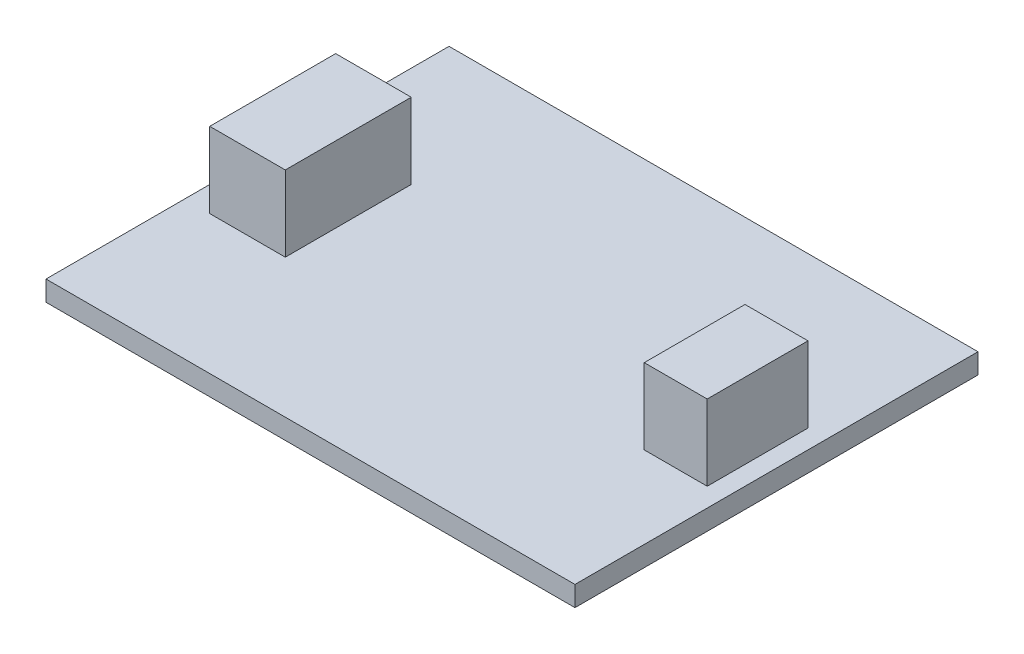
ISO-10303-21;
HEADER;
FILE_DESCRIPTION(('STEP AP214'),'2;1');
FILE_NAME('part.step','',(''),(''),'','','');
FILE_SCHEMA(('AUTOMOTIVE_DESIGN { 1 0 10303 214 1 1 1 1 }'));
ENDSEC;
DATA;
#1=APPLICATION_CONTEXT('core data for automotive mechanical design processes');
#2=APPLICATION_PROTOCOL_DEFINITION('international standard','automotive_design',2000,#1);
#3=PRODUCT_CONTEXT('',#1,'mechanical');
#4=PRODUCT('Part','Part','',(#3));
#5=PRODUCT_RELATED_PRODUCT_CATEGORY('part','',(#4));
#6=PRODUCT_DEFINITION_FORMATION('','',#4);
#7=PRODUCT_DEFINITION_CONTEXT('part definition',#1,'design');
#8=PRODUCT_DEFINITION('design','',#6,#7);
#9=PRODUCT_DEFINITION_SHAPE('','',#8);
#10=(LENGTH_UNIT() NAMED_UNIT(*) SI_UNIT(.MILLI.,.METRE.));
#11=(NAMED_UNIT(*) PLANE_ANGLE_UNIT() SI_UNIT($,.RADIAN.));
#12=(NAMED_UNIT(*) SI_UNIT($,.STERADIAN.) SOLID_ANGLE_UNIT());
#13=UNCERTAINTY_MEASURE_WITH_UNIT(LENGTH_MEASURE(1.E-05),#10,'distance_accuracy_value','');
#14=(GEOMETRIC_REPRESENTATION_CONTEXT(3) GLOBAL_UNCERTAINTY_ASSIGNED_CONTEXT((#13)) GLOBAL_UNIT_ASSIGNED_CONTEXT((#10,
#11,#12)) REPRESENTATION_CONTEXT('',''));
#15=CARTESIAN_POINT('',(0.,0.,0.));
#16=DIRECTION('',(0.,0.,1.));
#17=DIRECTION('',(1.,0.,0.));
#18=AXIS2_PLACEMENT_3D('',#15,#16,#17);
#19=CARTESIAN_POINT('',(0.,1.6,0.));
#20=DIRECTION('',(0.,-1.,0.));
#21=DIRECTION('',(0.,0.,-1.));
#22=AXIS2_PLACEMENT_3D('',#19,#20,#21);
#23=PLANE('',#22);
#24=DIRECTION('',(0.,0.,1.));
#25=VECTOR('',#24,1.);
#26=CARTESIAN_POINT('',(-19.,1.6,-5.));
#27=LINE('',#26,#25);
#28=CARTESIAN_POINT('',(-19.,1.6,-5.));
#29=VERTEX_POINT('',#28);
#30=CARTESIAN_POINT('',(-19.,1.6,5.));
#31=VERTEX_POINT('',#30);
#32=EDGE_CURVE('E160',#29,#31,#27,.T.);
#33=ORIENTED_EDGE('',*,*,#32,.F.);
#34=DIRECTION('',(-1.,0.,0.));
#35=VECTOR('',#34,1.);
#36=CARTESIAN_POINT('',(-13.,1.6,-5.));
#37=LINE('',#36,#35);
#38=CARTESIAN_POINT('',(-13.,1.6,-5.));
#39=VERTEX_POINT('',#38);
#40=EDGE_CURVE('E168',#39,#29,#37,.T.);
#41=ORIENTED_EDGE('',*,*,#40,.F.);
#42=DIRECTION('',(0.,0.,-1.));
#43=VECTOR('',#42,1.);
#44=CARTESIAN_POINT('',(-13.,1.6,5.));
#45=LINE('',#44,#43);
#46=CARTESIAN_POINT('',(-13.,1.6,5.));
#47=VERTEX_POINT('',#46);
#48=EDGE_CURVE('E176',#47,#39,#45,.T.);
#49=ORIENTED_EDGE('',*,*,#48,.F.);
#50=DIRECTION('',(1.,0.,0.));
#51=VECTOR('',#50,1.);
#52=CARTESIAN_POINT('',(-19.,1.6,5.));
#53=LINE('',#52,#51);
#54=EDGE_CURVE('E159',#31,#47,#53,.T.);
#55=ORIENTED_EDGE('',*,*,#54,.F.);
#56=EDGE_LOOP('',(#33,#41,#49,#55));
#57=FACE_BOUND('',#56,.T.);
#58=DIRECTION('',(0.,0.,-1.));
#59=VECTOR('',#58,1.);
#60=CARTESIAN_POINT('',(21.,1.6,16.));
#61=LINE('',#60,#59);
#62=CARTESIAN_POINT('',(21.,1.6,16.));
#63=VERTEX_POINT('',#62);
#64=CARTESIAN_POINT('',(21.,1.6,-16.));
#65=VERTEX_POINT('',#64);
#66=EDGE_CURVE('E198',#63,#65,#61,.T.);
#67=ORIENTED_EDGE('',*,*,#66,.T.);
#68=DIRECTION('',(-1.,0.,0.));
#69=VECTOR('',#68,1.);
#70=CARTESIAN_POINT('',(-21.,1.6,-16.));
#71=LINE('',#70,#69);
#72=CARTESIAN_POINT('',(-21.,1.6,-16.));
#73=VERTEX_POINT('',#72);
#74=EDGE_CURVE('E200',#65,#73,#71,.T.);
#75=ORIENTED_EDGE('',*,*,#74,.T.);
#76=DIRECTION('',(0.,0.,1.));
#77=VECTOR('',#76,1.);
#78=CARTESIAN_POINT('',(-21.,1.6,16.));
#79=LINE('',#78,#77);
#80=CARTESIAN_POINT('',(-21.,1.6,16.));
#81=VERTEX_POINT('',#80);
#82=EDGE_CURVE('E205',#73,#81,#79,.T.);
#83=ORIENTED_EDGE('',*,*,#82,.T.);
#84=DIRECTION('',(1.,0.,0.));
#85=VECTOR('',#84,1.);
#86=CARTESIAN_POINT('',(-21.,1.6,16.));
#87=LINE('',#86,#85);
#88=EDGE_CURVE('E204',#81,#63,#87,.T.);
#89=ORIENTED_EDGE('',*,*,#88,.T.);
#90=EDGE_LOOP('',(#67,#75,#83,#89));
#91=FACE_BOUND('',#90,.T.);
#92=DIRECTION('',(0.,0.,1.));
#93=VECTOR('',#92,1.);
#94=CARTESIAN_POINT('',(14.5,1.6,-4.));
#95=LINE('',#94,#93);
#96=CARTESIAN_POINT('',(14.5,1.6,-4.));
#97=VERTEX_POINT('',#96);
#98=CARTESIAN_POINT('',(14.5,1.6,4.));
#99=VERTEX_POINT('',#98);
#100=EDGE_CURVE('E156',#97,#99,#95,.T.);
#101=ORIENTED_EDGE('',*,*,#100,.F.);
#102=DIRECTION('',(-1.,0.,0.));
#103=VECTOR('',#102,1.);
#104=CARTESIAN_POINT('',(19.5,1.6,-4.));
#105=LINE('',#104,#103);
#106=CARTESIAN_POINT('',(19.5,1.6,-4.));
#107=VERTEX_POINT('',#106);
#108=EDGE_CURVE('E153',#107,#97,#105,.T.);
#109=ORIENTED_EDGE('',*,*,#108,.F.);
#110=DIRECTION('',(0.,0.,-1.));
#111=VECTOR('',#110,1.);
#112=CARTESIAN_POINT('',(19.5,1.6,4.));
#113=LINE('',#112,#111);
#114=CARTESIAN_POINT('',(19.5,1.6,4.));
#115=VERTEX_POINT('',#114);
#116=EDGE_CURVE('E69',#115,#107,#113,.T.);
#117=ORIENTED_EDGE('',*,*,#116,.F.);
#118=DIRECTION('',(1.,0.,0.));
#119=VECTOR('',#118,1.);
#120=CARTESIAN_POINT('',(14.5,1.6,4.));
#121=LINE('',#120,#119);
#122=EDGE_CURVE('E65',#99,#115,#121,.T.);
#123=ORIENTED_EDGE('',*,*,#122,.F.);
#124=EDGE_LOOP('',(#101,#109,#117,#123));
#125=FACE_BOUND('',#124,.T.);
#126=ADVANCED_FACE('F50',(#57,#91,#125),#23,.F.);
#127=CARTESIAN_POINT('',(21.,1.6,16.));
#128=DIRECTION('',(-1.,0.,0.));
#129=DIRECTION('',(0.,0.,1.));
#130=AXIS2_PLACEMENT_3D('',#127,#128,#129);
#131=PLANE('',#130);
#132=DIRECTION('',(0.,0.,-1.));
#133=VECTOR('',#132,1.);
#134=CARTESIAN_POINT('',(21.,0.,16.));
#135=LINE('',#134,#133);
#136=CARTESIAN_POINT('',(21.,0.,16.));
#137=VERTEX_POINT('',#136);
#138=CARTESIAN_POINT('',(21.,0.,-16.));
#139=VERTEX_POINT('',#138);
#140=EDGE_CURVE('E193',#137,#139,#135,.T.);
#141=ORIENTED_EDGE('',*,*,#140,.T.);
#142=DIRECTION('',(0.,-1.,0.));
#143=VECTOR('',#142,1.);
#144=CARTESIAN_POINT('',(21.,1.6,-16.));
#145=LINE('',#144,#143);
#146=EDGE_CURVE('E11',#65,#139,#145,.T.);
#147=ORIENTED_EDGE('',*,*,#146,.F.);
#148=ORIENTED_EDGE('',*,*,#66,.F.);
#149=DIRECTION('',(0.,-1.,0.));
#150=VECTOR('',#149,1.);
#151=CARTESIAN_POINT('',(21.,1.6,16.));
#152=LINE('',#151,#150);
#153=EDGE_CURVE('E206',#63,#137,#152,.T.);
#154=ORIENTED_EDGE('',*,*,#153,.T.);
#155=EDGE_LOOP('',(#141,#147,#148,#154));
#156=FACE_BOUND('',#155,.T.);
#157=ADVANCED_FACE('F47',(#156),#131,.F.);
#158=CARTESIAN_POINT('',(-21.,1.6,-16.));
#159=DIRECTION('',(0.,0.,1.));
#160=DIRECTION('',(1.,0.,0.));
#161=AXIS2_PLACEMENT_3D('',#158,#159,#160);
#162=PLANE('',#161);
#163=DIRECTION('',(-1.,0.,0.));
#164=VECTOR('',#163,1.);
#165=CARTESIAN_POINT('',(-21.,0.,-16.));
#166=LINE('',#165,#164);
#167=CARTESIAN_POINT('',(-21.,0.,-16.));
#168=VERTEX_POINT('',#167);
#169=EDGE_CURVE('E207',#139,#168,#166,.T.);
#170=ORIENTED_EDGE('',*,*,#169,.T.);
#171=DIRECTION('',(0.,-1.,0.));
#172=VECTOR('',#171,1.);
#173=CARTESIAN_POINT('',(-21.,1.6,-16.));
#174=LINE('',#173,#172);
#175=EDGE_CURVE('E54',#73,#168,#174,.T.);
#176=ORIENTED_EDGE('',*,*,#175,.F.);
#177=ORIENTED_EDGE('',*,*,#74,.F.);
#178=ORIENTED_EDGE('',*,*,#146,.T.);
#179=EDGE_LOOP('',(#170,#176,#177,#178));
#180=FACE_BOUND('',#179,.T.);
#181=ADVANCED_FACE('F236',(#180),#162,.F.);
#182=CARTESIAN_POINT('',(-21.,1.6,16.));
#183=DIRECTION('',(1.,0.,0.));
#184=DIRECTION('',(0.,0.,-1.));
#185=AXIS2_PLACEMENT_3D('',#182,#183,#184);
#186=PLANE('',#185);
#187=DIRECTION('',(0.,0.,1.));
#188=VECTOR('',#187,1.);
#189=CARTESIAN_POINT('',(-21.,0.,16.));
#190=LINE('',#189,#188);
#191=CARTESIAN_POINT('',(-21.,0.,16.));
#192=VERTEX_POINT('',#191);
#193=EDGE_CURVE('E211',#168,#192,#190,.T.);
#194=ORIENTED_EDGE('',*,*,#193,.T.);
#195=DIRECTION('',(0.,-1.,0.));
#196=VECTOR('',#195,1.);
#197=CARTESIAN_POINT('',(-21.,1.6,16.));
#198=LINE('',#197,#196);
#199=EDGE_CURVE('E216',#81,#192,#198,.T.);
#200=ORIENTED_EDGE('',*,*,#199,.F.);
#201=ORIENTED_EDGE('',*,*,#82,.F.);
#202=ORIENTED_EDGE('',*,*,#175,.T.);
#203=EDGE_LOOP('',(#194,#200,#201,#202));
#204=FACE_BOUND('',#203,.T.);
#205=ADVANCED_FACE('F224',(#204),#186,.F.);
#206=CARTESIAN_POINT('',(-21.,1.6,16.));
#207=DIRECTION('',(0.,0.,-1.));
#208=DIRECTION('',(-1.,0.,0.));
#209=AXIS2_PLACEMENT_3D('',#206,#207,#208);
#210=PLANE('',#209);
#211=DIRECTION('',(1.,0.,0.));
#212=VECTOR('',#211,1.);
#213=CARTESIAN_POINT('',(-21.,0.,16.));
#214=LINE('',#213,#212);
#215=EDGE_CURVE('E199',#192,#137,#214,.T.);
#216=ORIENTED_EDGE('',*,*,#215,.T.);
#217=ORIENTED_EDGE('',*,*,#153,.F.);
#218=ORIENTED_EDGE('',*,*,#88,.F.);
#219=ORIENTED_EDGE('',*,*,#199,.T.);
#220=EDGE_LOOP('',(#216,#217,#218,#219));
#221=FACE_BOUND('',#220,.T.);
#222=ADVANCED_FACE('F234',(#221),#210,.F.);
#223=CARTESIAN_POINT('',(0.,0.,0.));
#224=DIRECTION('',(0.,-1.,0.));
#225=DIRECTION('',(0.,0.,-1.));
#226=AXIS2_PLACEMENT_3D('',#223,#224,#225);
#227=PLANE('',#226);
#228=ORIENTED_EDGE('',*,*,#140,.F.);
#229=ORIENTED_EDGE('',*,*,#215,.F.);
#230=ORIENTED_EDGE('',*,*,#193,.F.);
#231=ORIENTED_EDGE('',*,*,#169,.F.);
#232=EDGE_LOOP('',(#228,#229,#230,#231));
#233=FACE_BOUND('',#232,.T.);
#234=ADVANCED_FACE('F229',(#233),#227,.T.);
#235=CARTESIAN_POINT('',(-19.,7.6,-5.));
#236=DIRECTION('',(1.,0.,0.));
#237=DIRECTION('',(0.,0.,-1.));
#238=AXIS2_PLACEMENT_3D('',#235,#236,#237);
#239=PLANE('',#238);
#240=ORIENTED_EDGE('',*,*,#32,.T.);
#241=DIRECTION('',(0.,-1.,0.));
#242=VECTOR('',#241,1.);
#243=CARTESIAN_POINT('',(-19.,7.6,5.));
#244=LINE('',#243,#242);
#245=CARTESIAN_POINT('',(-19.,7.6,5.));
#246=VERTEX_POINT('',#245);
#247=EDGE_CURVE('E194',#246,#31,#244,.T.);
#248=ORIENTED_EDGE('',*,*,#247,.F.);
#249=DIRECTION('',(0.,0.,1.));
#250=VECTOR('',#249,1.);
#251=CARTESIAN_POINT('',(-19.,7.6,-5.));
#252=LINE('',#251,#250);
#253=CARTESIAN_POINT('',(-19.,7.6,-5.));
#254=VERTEX_POINT('',#253);
#255=EDGE_CURVE('E167',#254,#246,#252,.T.);
#256=ORIENTED_EDGE('',*,*,#255,.F.);
#257=DIRECTION('',(0.,-1.,0.));
#258=VECTOR('',#257,1.);
#259=CARTESIAN_POINT('',(-19.,7.6,-5.));
#260=LINE('',#259,#258);
#261=EDGE_CURVE('E172',#254,#29,#260,.T.);
#262=ORIENTED_EDGE('',*,*,#261,.T.);
#263=EDGE_LOOP('',(#240,#248,#256,#262));
#264=FACE_BOUND('',#263,.T.);
#265=ADVANCED_FACE('F255',(#264),#239,.F.);
#266=CARTESIAN_POINT('',(-19.,7.6,5.));
#267=DIRECTION('',(0.,0.,-1.));
#268=DIRECTION('',(-1.,0.,0.));
#269=AXIS2_PLACEMENT_3D('',#266,#267,#268);
#270=PLANE('',#269);
#271=ORIENTED_EDGE('',*,*,#54,.T.);
#272=DIRECTION('',(0.,-1.,0.));
#273=VECTOR('',#272,1.);
#274=CARTESIAN_POINT('',(-13.,7.6,5.));
#275=LINE('',#274,#273);
#276=CARTESIAN_POINT('',(-13.,7.6,5.));
#277=VERTEX_POINT('',#276);
#278=EDGE_CURVE('E189',#277,#47,#275,.T.);
#279=ORIENTED_EDGE('',*,*,#278,.F.);
#280=DIRECTION('',(1.,0.,0.));
#281=VECTOR('',#280,1.);
#282=CARTESIAN_POINT('',(-19.,7.6,5.));
#283=LINE('',#282,#281);
#284=EDGE_CURVE('E166',#246,#277,#283,.T.);
#285=ORIENTED_EDGE('',*,*,#284,.F.);
#286=ORIENTED_EDGE('',*,*,#247,.T.);
#287=EDGE_LOOP('',(#271,#279,#285,#286));
#288=FACE_BOUND('',#287,.T.);
#289=ADVANCED_FACE('F280',(#288),#270,.F.);
#290=CARTESIAN_POINT('',(-13.,7.6,5.));
#291=DIRECTION('',(-1.,0.,0.));
#292=DIRECTION('',(0.,0.,1.));
#293=AXIS2_PLACEMENT_3D('',#290,#291,#292);
#294=PLANE('',#293);
#295=ORIENTED_EDGE('',*,*,#48,.T.);
#296=DIRECTION('',(0.,-1.,0.));
#297=VECTOR('',#296,1.);
#298=CARTESIAN_POINT('',(-13.,7.6,-5.));
#299=LINE('',#298,#297);
#300=CARTESIAN_POINT('',(-13.,7.6,-5.));
#301=VERTEX_POINT('',#300);
#302=EDGE_CURVE('E188',#301,#39,#299,.T.);
#303=ORIENTED_EDGE('',*,*,#302,.F.);
#304=DIRECTION('',(0.,0.,-1.));
#305=VECTOR('',#304,1.);
#306=CARTESIAN_POINT('',(-13.,7.6,5.));
#307=LINE('',#306,#305);
#308=EDGE_CURVE('E175',#277,#301,#307,.T.);
#309=ORIENTED_EDGE('',*,*,#308,.F.);
#310=ORIENTED_EDGE('',*,*,#278,.T.);
#311=EDGE_LOOP('',(#295,#303,#309,#310));
#312=FACE_BOUND('',#311,.T.);
#313=ADVANCED_FACE('F290',(#312),#294,.F.);
#314=CARTESIAN_POINT('',(-13.,7.6,-5.));
#315=DIRECTION('',(0.,0.,1.));
#316=DIRECTION('',(1.,0.,0.));
#317=AXIS2_PLACEMENT_3D('',#314,#315,#316);
#318=PLANE('',#317);
#319=ORIENTED_EDGE('',*,*,#40,.T.);
#320=ORIENTED_EDGE('',*,*,#261,.F.);
#321=DIRECTION('',(-1.,0.,0.));
#322=VECTOR('',#321,1.);
#323=CARTESIAN_POINT('',(-13.,7.6,-5.));
#324=LINE('',#323,#322);
#325=EDGE_CURVE('E174',#301,#254,#324,.T.);
#326=ORIENTED_EDGE('',*,*,#325,.F.);
#327=ORIENTED_EDGE('',*,*,#302,.T.);
#328=EDGE_LOOP('',(#319,#320,#326,#327));
#329=FACE_BOUND('',#328,.T.);
#330=ADVANCED_FACE('F299',(#329),#318,.F.);
#331=CARTESIAN_POINT('',(0.,7.6,0.));
#332=DIRECTION('',(0.,1.,0.));
#333=DIRECTION('',(0.,0.,1.));
#334=AXIS2_PLACEMENT_3D('',#331,#332,#333);
#335=PLANE('',#334);
#336=ORIENTED_EDGE('',*,*,#255,.T.);
#337=ORIENTED_EDGE('',*,*,#284,.T.);
#338=ORIENTED_EDGE('',*,*,#308,.T.);
#339=ORIENTED_EDGE('',*,*,#325,.T.);
#340=EDGE_LOOP('',(#336,#337,#338,#339));
#341=FACE_BOUND('',#340,.T.);
#342=ADVANCED_FACE('F309',(#341),#335,.T.);
#343=CARTESIAN_POINT('',(14.5,7.6,-4.));
#344=DIRECTION('',(1.,0.,0.));
#345=DIRECTION('',(0.,0.,-1.));
#346=AXIS2_PLACEMENT_3D('',#343,#344,#345);
#347=PLANE('',#346);
#348=ORIENTED_EDGE('',*,*,#100,.T.);
#349=DIRECTION('',(0.,-1.,0.));
#350=VECTOR('',#349,1.);
#351=CARTESIAN_POINT('',(14.5,7.6,4.));
#352=LINE('',#351,#350);
#353=CARTESIAN_POINT('',(14.5,7.6,4.));
#354=VERTEX_POINT('',#353);
#355=EDGE_CURVE('E139',#354,#99,#352,.T.);
#356=ORIENTED_EDGE('',*,*,#355,.F.);
#357=DIRECTION('',(0.,0.,1.));
#358=VECTOR('',#357,1.);
#359=CARTESIAN_POINT('',(14.5,7.6,-4.));
#360=LINE('',#359,#358);
#361=CARTESIAN_POINT('',(14.5,7.6,-4.));
#362=VERTEX_POINT('',#361);
#363=EDGE_CURVE('E145',#362,#354,#360,.T.);
#364=ORIENTED_EDGE('',*,*,#363,.F.);
#365=DIRECTION('',(0.,-1.,0.));
#366=VECTOR('',#365,1.);
#367=CARTESIAN_POINT('',(14.5,7.6,-4.));
#368=LINE('',#367,#366);
#369=EDGE_CURVE('E416',#362,#97,#368,.T.);
#370=ORIENTED_EDGE('',*,*,#369,.T.);
#371=EDGE_LOOP('',(#348,#356,#364,#370));
#372=FACE_BOUND('',#371,.T.);
#373=ADVANCED_FACE('F154',(#372),#347,.F.);
#374=CARTESIAN_POINT('',(14.5,7.6,4.));
#375=DIRECTION('',(0.,0.,-1.));
#376=DIRECTION('',(-1.,0.,0.));
#377=AXIS2_PLACEMENT_3D('',#374,#375,#376);
#378=PLANE('',#377);
#379=ORIENTED_EDGE('',*,*,#122,.T.);
#380=DIRECTION('',(0.,-1.,0.));
#381=VECTOR('',#380,1.);
#382=CARTESIAN_POINT('',(19.5,7.6,4.));
#383=LINE('',#382,#381);
#384=CARTESIAN_POINT('',(19.5,7.6,4.));
#385=VERTEX_POINT('',#384);
#386=EDGE_CURVE('E138',#385,#115,#383,.T.);
#387=ORIENTED_EDGE('',*,*,#386,.F.);
#388=DIRECTION('',(1.,0.,0.));
#389=VECTOR('',#388,1.);
#390=CARTESIAN_POINT('',(14.5,7.6,4.));
#391=LINE('',#390,#389);
#392=EDGE_CURVE('E131',#354,#385,#391,.T.);
#393=ORIENTED_EDGE('',*,*,#392,.F.);
#394=ORIENTED_EDGE('',*,*,#355,.T.);
#395=EDGE_LOOP('',(#379,#387,#393,#394));
#396=FACE_BOUND('',#395,.T.);
#397=ADVANCED_FACE('F132',(#396),#378,.F.);
#398=CARTESIAN_POINT('',(19.5,7.6,4.));
#399=DIRECTION('',(-1.,0.,0.));
#400=DIRECTION('',(0.,0.,1.));
#401=AXIS2_PLACEMENT_3D('',#398,#399,#400);
#402=PLANE('',#401);
#403=ORIENTED_EDGE('',*,*,#116,.T.);
#404=DIRECTION('',(0.,-1.,0.));
#405=VECTOR('',#404,1.);
#406=CARTESIAN_POINT('',(19.5,7.6,-4.));
#407=LINE('',#406,#405);
#408=CARTESIAN_POINT('',(19.5,7.6,-4.));
#409=VERTEX_POINT('',#408);
#410=EDGE_CURVE('E165',#409,#107,#407,.T.);
#411=ORIENTED_EDGE('',*,*,#410,.F.);
#412=DIRECTION('',(0.,0.,-1.));
#413=VECTOR('',#412,1.);
#414=CARTESIAN_POINT('',(19.5,7.6,4.));
#415=LINE('',#414,#413);
#416=EDGE_CURVE('E141',#385,#409,#415,.T.);
#417=ORIENTED_EDGE('',*,*,#416,.F.);
#418=ORIENTED_EDGE('',*,*,#386,.T.);
#419=EDGE_LOOP('',(#403,#411,#417,#418));
#420=FACE_BOUND('',#419,.T.);
#421=ADVANCED_FACE('F337',(#420),#402,.F.);
#422=CARTESIAN_POINT('',(19.5,7.6,-4.));
#423=DIRECTION('',(0.,0.,1.));
#424=DIRECTION('',(1.,0.,0.));
#425=AXIS2_PLACEMENT_3D('',#422,#423,#424);
#426=PLANE('',#425);
#427=ORIENTED_EDGE('',*,*,#108,.T.);
#428=ORIENTED_EDGE('',*,*,#369,.F.);
#429=DIRECTION('',(-1.,0.,0.));
#430=VECTOR('',#429,1.);
#431=CARTESIAN_POINT('',(19.5,7.6,-4.));
#432=LINE('',#431,#430);
#433=EDGE_CURVE('E149',#409,#362,#432,.T.);
#434=ORIENTED_EDGE('',*,*,#433,.F.);
#435=ORIENTED_EDGE('',*,*,#410,.T.);
#436=EDGE_LOOP('',(#427,#428,#434,#435));
#437=FACE_BOUND('',#436,.T.);
#438=ADVANCED_FACE('F349',(#437),#426,.F.);
#439=CARTESIAN_POINT('',(0.,7.6,0.));
#440=DIRECTION('',(0.,1.,0.));
#441=DIRECTION('',(0.,0.,1.));
#442=AXIS2_PLACEMENT_3D('',#439,#440,#441);
#443=PLANE('',#442);
#444=ORIENTED_EDGE('',*,*,#363,.T.);
#445=ORIENTED_EDGE('',*,*,#392,.T.);
#446=ORIENTED_EDGE('',*,*,#416,.T.);
#447=ORIENTED_EDGE('',*,*,#433,.T.);
#448=EDGE_LOOP('',(#444,#445,#446,#447));
#449=FACE_BOUND('',#448,.T.);
#450=ADVANCED_FACE('F150',(#449),#443,.T.);
#451=CLOSED_SHELL('',(#126,#157,#181,#205,#222,#234,#265,#289,#313,#330,#342,#373,#397,#421,
#438,#450));
#452=MANIFOLD_SOLID_BREP('B2',#451);
#453=ADVANCED_BREP_SHAPE_REPRESENTATION('',(#18,#452),#14);
#454=SHAPE_DEFINITION_REPRESENTATION(#9,#453);
ENDSEC;
END-ISO-10303-21;
